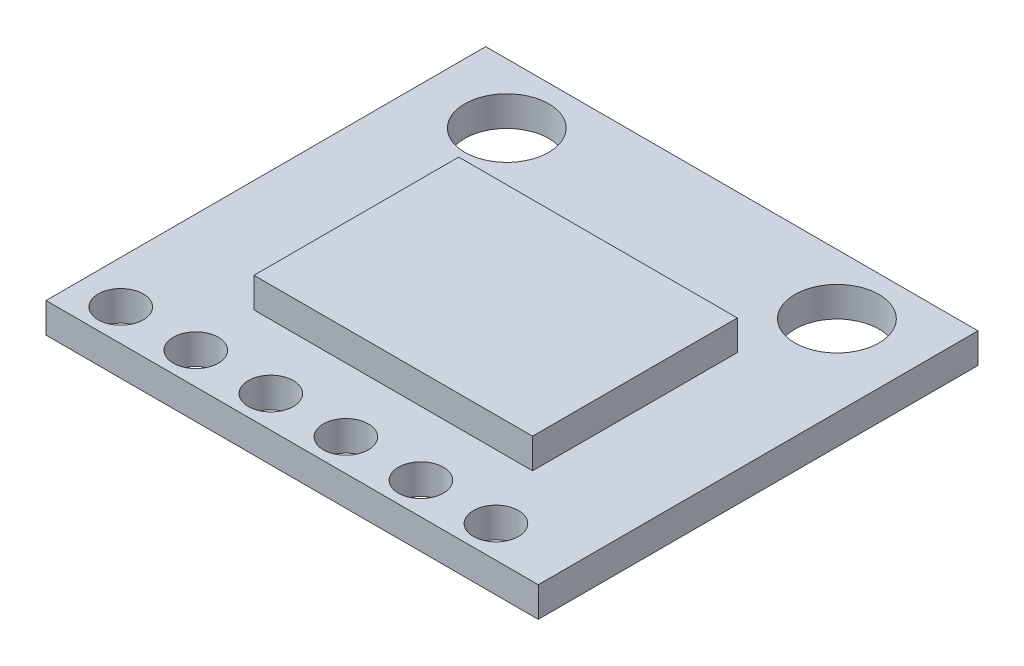
ISO-10303-21;
HEADER;
FILE_DESCRIPTION(('STEP AP214'),'2;1');
FILE_NAME('part.step','',(''),(''),'','','');
FILE_SCHEMA(('AUTOMOTIVE_DESIGN { 1 0 10303 214 1 1 1 1 }'));
ENDSEC;
DATA;
#1=APPLICATION_CONTEXT('core data for automotive mechanical design processes');
#2=APPLICATION_PROTOCOL_DEFINITION('international standard','automotive_design',2000,#1);
#3=PRODUCT_CONTEXT('',#1,'mechanical');
#4=PRODUCT('Part','Part','',(#3));
#5=PRODUCT_RELATED_PRODUCT_CATEGORY('part','',(#4));
#6=PRODUCT_DEFINITION_FORMATION('','',#4);
#7=PRODUCT_DEFINITION_CONTEXT('part definition',#1,'design');
#8=PRODUCT_DEFINITION('design','',#6,#7);
#9=PRODUCT_DEFINITION_SHAPE('','',#8);
#10=(LENGTH_UNIT() NAMED_UNIT(*) SI_UNIT(.MILLI.,.METRE.));
#11=(NAMED_UNIT(*) PLANE_ANGLE_UNIT() SI_UNIT($,.RADIAN.));
#12=(NAMED_UNIT(*) SI_UNIT($,.STERADIAN.) SOLID_ANGLE_UNIT());
#13=UNCERTAINTY_MEASURE_WITH_UNIT(LENGTH_MEASURE(1.E-05),#10,'distance_accuracy_value','');
#14=(GEOMETRIC_REPRESENTATION_CONTEXT(3) GLOBAL_UNCERTAINTY_ASSIGNED_CONTEXT((#13)) GLOBAL_UNIT_ASSIGNED_CONTEXT((#10,
#11,#12)) REPRESENTATION_CONTEXT('',''));
#15=CARTESIAN_POINT('',(0.,0.,0.));
#16=DIRECTION('',(0.,0.,1.));
#17=DIRECTION('',(1.,0.,0.));
#18=AXIS2_PLACEMENT_3D('',#15,#16,#17);
#19=CARTESIAN_POINT('',(0.,1.,0.));
#20=DIRECTION('',(0.,-1.,0.));
#21=DIRECTION('',(0.,0.,-1.));
#22=AXIS2_PLACEMENT_3D('',#19,#20,#21);
#23=PLANE('',#22);
#24=DIRECTION('',(0.,0.,1.));
#25=VECTOR('',#24,1.);
#26=CARTESIAN_POINT('',(0.,1.,0.));
#27=LINE('',#26,#25);
#28=CARTESIAN_POINT('',(0.,1.,-14.65));
#29=VERTEX_POINT('',#28);
#30=CARTESIAN_POINT('',(0.,1.,0.));
#31=VERTEX_POINT('',#30);
#32=EDGE_CURVE('E177',#29,#31,#27,.T.);
#33=ORIENTED_EDGE('',*,*,#32,.T.);
#34=DIRECTION('',(1.,0.,0.));
#35=VECTOR('',#34,1.);
#36=CARTESIAN_POINT('',(0.,1.,0.));
#37=LINE('',#36,#35);
#38=CARTESIAN_POINT('',(16.4,1.,0.));
#39=VERTEX_POINT('',#38);
#40=EDGE_CURVE('E180',#31,#39,#37,.T.);
#41=ORIENTED_EDGE('',*,*,#40,.T.);
#42=DIRECTION('',(0.,0.,-1.));
#43=VECTOR('',#42,1.);
#44=CARTESIAN_POINT('',(16.4,1.,0.));
#45=LINE('',#44,#43);
#46=CARTESIAN_POINT('',(16.4,1.,-14.65));
#47=VERTEX_POINT('',#46);
#48=EDGE_CURVE('E183',#39,#47,#45,.T.);
#49=ORIENTED_EDGE('',*,*,#48,.T.);
#50=DIRECTION('',(-1.,0.,0.));
#51=VECTOR('',#50,1.);
#52=CARTESIAN_POINT('',(0.,1.,-14.65));
#53=LINE('',#52,#51);
#54=EDGE_CURVE('E185',#47,#29,#53,.T.);
#55=ORIENTED_EDGE('',*,*,#54,.T.);
#56=EDGE_LOOP('',(#33,#41,#49,#55));
#57=FACE_BOUND('',#56,.T.);
#58=CARTESIAN_POINT('',(1.42900438295839,1.,-1.06119506588286));
#59=DIRECTION('',(0.,1.,0.));
#60=DIRECTION('',(0.,0.,1.));
#61=AXIS2_PLACEMENT_3D('',#58,#59,#60);
#62=CIRCLE('',#61,0.75);
#63=CARTESIAN_POINT('',(1.42900438295839,1.,-0.311195065882863));
#64=VERTEX_POINT('',#63);
#65=EDGE_CURVE('E150',#64,#64,#62,.T.);
#66=ORIENTED_EDGE('',*,*,#65,.F.);
#67=EDGE_LOOP('',(#66));
#68=FACE_BOUND('',#67,.T.);
#69=CARTESIAN_POINT('',(13.9290043829584,1.,-1.06119506588286));
#70=DIRECTION('',(0.,1.,0.));
#71=DIRECTION('',(0.,0.,1.));
#72=AXIS2_PLACEMENT_3D('',#69,#70,#71);
#73=CIRCLE('',#72,0.75);
#74=CARTESIAN_POINT('',(13.9290043829584,1.,-0.311195065882862));
#75=VERTEX_POINT('',#74);
#76=EDGE_CURVE('E135',#75,#75,#73,.T.);
#77=ORIENTED_EDGE('',*,*,#76,.F.);
#78=EDGE_LOOP('',(#77));
#79=FACE_BOUND('',#78,.T.);
#80=CARTESIAN_POINT('',(2.7,1.,-12.65));
#81=DIRECTION('',(0.,1.,0.));
#82=DIRECTION('',(0.,0.,1.));
#83=AXIS2_PLACEMENT_3D('',#80,#81,#82);
#84=CIRCLE('',#83,1.4);
#85=CARTESIAN_POINT('',(2.7,1.,-11.25));
#86=VERTEX_POINT('',#85);
#87=EDGE_CURVE('E142',#86,#86,#84,.T.);
#88=ORIENTED_EDGE('',*,*,#87,.F.);
#89=EDGE_LOOP('',(#88));
#90=FACE_BOUND('',#89,.T.);
#91=CARTESIAN_POINT('',(13.7,1.,-12.65));
#92=DIRECTION('',(0.,1.,0.));
#93=DIRECTION('',(0.,0.,1.));
#94=AXIS2_PLACEMENT_3D('',#91,#92,#93);
#95=CIRCLE('',#94,1.4);
#96=CARTESIAN_POINT('',(13.7,1.,-11.25));
#97=VERTEX_POINT('',#96);
#98=EDGE_CURVE('E126',#97,#97,#95,.T.);
#99=ORIENTED_EDGE('',*,*,#98,.F.);
#100=EDGE_LOOP('',(#99));
#101=FACE_BOUND('',#100,.T.);
#102=CARTESIAN_POINT('',(11.4290043829584,1.,-1.06119506588286));
#103=DIRECTION('',(0.,1.,0.));
#104=DIRECTION('',(0.,0.,1.));
#105=AXIS2_PLACEMENT_3D('',#102,#103,#104);
#106=CIRCLE('',#105,0.75);
#107=CARTESIAN_POINT('',(11.4290043829584,1.,-0.311195065882862));
#108=VERTEX_POINT('',#107);
#109=EDGE_CURVE('E166',#108,#108,#106,.T.);
#110=ORIENTED_EDGE('',*,*,#109,.F.);
#111=EDGE_LOOP('',(#110));
#112=FACE_BOUND('',#111,.T.);
#113=CARTESIAN_POINT('',(8.92900438295839,1.,-1.06119506588286));
#114=DIRECTION('',(0.,1.,0.));
#115=DIRECTION('',(0.,0.,1.));
#116=AXIS2_PLACEMENT_3D('',#113,#114,#115);
#117=CIRCLE('',#116,0.75);
#118=CARTESIAN_POINT('',(8.92900438295839,1.,-0.311195065882862));
#119=VERTEX_POINT('',#118);
#120=EDGE_CURVE('E160',#119,#119,#117,.T.);
#121=ORIENTED_EDGE('',*,*,#120,.F.);
#122=EDGE_LOOP('',(#121));
#123=FACE_BOUND('',#122,.T.);
#124=CARTESIAN_POINT('',(6.42900438295839,1.,-1.06119506588286));
#125=DIRECTION('',(0.,1.,0.));
#126=DIRECTION('',(0.,0.,1.));
#127=AXIS2_PLACEMENT_3D('',#124,#125,#126);
#128=CIRCLE('',#127,0.749999999999999);
#129=CARTESIAN_POINT('',(6.42900438295839,1.,-0.311195065882863));
#130=VERTEX_POINT('',#129);
#131=EDGE_CURVE('E154',#130,#130,#128,.T.);
#132=ORIENTED_EDGE('',*,*,#131,.F.);
#133=EDGE_LOOP('',(#132));
#134=FACE_BOUND('',#133,.T.);
#135=CARTESIAN_POINT('',(3.92900438295839,1.,-1.06119506588286));
#136=DIRECTION('',(0.,1.,0.));
#137=DIRECTION('',(0.,0.,1.));
#138=AXIS2_PLACEMENT_3D('',#135,#136,#137);
#139=CIRCLE('',#138,0.749999999999999);
#140=CARTESIAN_POINT('',(3.92900438295839,1.,-0.311195065882863));
#141=VERTEX_POINT('',#140);
#142=EDGE_CURVE('E147',#141,#141,#139,.T.);
#143=ORIENTED_EDGE('',*,*,#142,.F.);
#144=EDGE_LOOP('',(#143));
#145=FACE_BOUND('',#144,.T.);
#146=DIRECTION('',(0.,0.,1.));
#147=VECTOR('',#146,1.);
#148=CARTESIAN_POINT('',(3.7367219902647,1.,-10.0131106194997));
#149=LINE('',#148,#147);
#150=CARTESIAN_POINT('',(3.7367219902647,1.,-10.0131106194997));
#151=VERTEX_POINT('',#150);
#152=CARTESIAN_POINT('',(3.7367219902647,1.,-3.19139593416561));
#153=VERTEX_POINT('',#152);
#154=EDGE_CURVE('E122',#151,#153,#149,.T.);
#155=ORIENTED_EDGE('',*,*,#154,.F.);
#156=DIRECTION('',(-1.,0.,0.));
#157=VECTOR('',#156,1.);
#158=CARTESIAN_POINT('',(3.7367219902647,1.,-10.0131106194997));
#159=LINE('',#158,#157);
#160=CARTESIAN_POINT('',(13.0183114877824,1.,-10.0131106194997));
#161=VERTEX_POINT('',#160);
#162=EDGE_CURVE('E119',#161,#151,#159,.T.);
#163=ORIENTED_EDGE('',*,*,#162,.F.);
#164=DIRECTION('',(0.,0.,-1.));
#165=VECTOR('',#164,1.);
#166=CARTESIAN_POINT('',(13.0183114877824,1.,-10.0131106194997));
#167=LINE('',#166,#165);
#168=CARTESIAN_POINT('',(13.0183114877824,1.,-3.19139593416561));
#169=VERTEX_POINT('',#168);
#170=EDGE_CURVE('E57',#169,#161,#167,.T.);
#171=ORIENTED_EDGE('',*,*,#170,.F.);
#172=DIRECTION('',(1.,0.,0.));
#173=VECTOR('',#172,1.);
#174=CARTESIAN_POINT('',(3.7367219902647,1.,-3.19139593416561));
#175=LINE('',#174,#173);
#176=EDGE_CURVE('E52',#153,#169,#175,.T.);
#177=ORIENTED_EDGE('',*,*,#176,.F.);
#178=EDGE_LOOP('',(#155,#163,#171,#177));
#179=FACE_BOUND('',#178,.T.);
#180=ADVANCED_FACE('F37',(#57,#68,#79,#90,#101,#112,#123,#134,#145,#179),#23,.F.);
#181=CARTESIAN_POINT('',(0.,1.,0.));
#182=DIRECTION('',(1.,0.,0.));
#183=DIRECTION('',(0.,0.,-1.));
#184=AXIS2_PLACEMENT_3D('',#181,#182,#183);
#185=PLANE('',#184);
#186=DIRECTION('',(0.,0.,1.));
#187=VECTOR('',#186,1.);
#188=CARTESIAN_POINT('',(0.,0.,0.));
#189=LINE('',#188,#187);
#190=CARTESIAN_POINT('',(0.,0.,-14.65));
#191=VERTEX_POINT('',#190);
#192=CARTESIAN_POINT('',(0.,0.,0.));
#193=VERTEX_POINT('',#192);
#194=EDGE_CURVE('E174',#191,#193,#189,.T.);
#195=ORIENTED_EDGE('',*,*,#194,.T.);
#196=DIRECTION('',(0.,-1.,0.));
#197=VECTOR('',#196,1.);
#198=CARTESIAN_POINT('',(0.,1.,0.));
#199=LINE('',#198,#197);
#200=EDGE_CURVE('E11',#31,#193,#199,.T.);
#201=ORIENTED_EDGE('',*,*,#200,.F.);
#202=ORIENTED_EDGE('',*,*,#32,.F.);
#203=DIRECTION('',(0.,-1.,0.));
#204=VECTOR('',#203,1.);
#205=CARTESIAN_POINT('',(0.,1.,-14.65));
#206=LINE('',#205,#204);
#207=EDGE_CURVE('E187',#29,#191,#206,.T.);
#208=ORIENTED_EDGE('',*,*,#207,.T.);
#209=EDGE_LOOP('',(#195,#201,#202,#208));
#210=FACE_BOUND('',#209,.T.);
#211=ADVANCED_FACE('F39',(#210),#185,.F.);
#212=CARTESIAN_POINT('',(0.,1.,0.));
#213=DIRECTION('',(0.,0.,-1.));
#214=DIRECTION('',(-1.,0.,0.));
#215=AXIS2_PLACEMENT_3D('',#212,#213,#214);
#216=PLANE('',#215);
#217=DIRECTION('',(1.,0.,0.));
#218=VECTOR('',#217,1.);
#219=CARTESIAN_POINT('',(0.,0.,0.));
#220=LINE('',#219,#218);
#221=CARTESIAN_POINT('',(16.4,0.,0.));
#222=VERTEX_POINT('',#221);
#223=EDGE_CURVE('E190',#193,#222,#220,.T.);
#224=ORIENTED_EDGE('',*,*,#223,.T.);
#225=DIRECTION('',(0.,-1.,0.));
#226=VECTOR('',#225,1.);
#227=CARTESIAN_POINT('',(16.4,1.,0.));
#228=LINE('',#227,#226);
#229=EDGE_CURVE('E45',#39,#222,#228,.T.);
#230=ORIENTED_EDGE('',*,*,#229,.F.);
#231=ORIENTED_EDGE('',*,*,#40,.F.);
#232=ORIENTED_EDGE('',*,*,#200,.T.);
#233=EDGE_LOOP('',(#224,#230,#231,#232));
#234=FACE_BOUND('',#233,.T.);
#235=ADVANCED_FACE('F220',(#234),#216,.F.);
#236=CARTESIAN_POINT('',(16.4,1.,0.));
#237=DIRECTION('',(-1.,0.,0.));
#238=DIRECTION('',(0.,0.,1.));
#239=AXIS2_PLACEMENT_3D('',#236,#237,#238);
#240=PLANE('',#239);
#241=DIRECTION('',(0.,0.,-1.));
#242=VECTOR('',#241,1.);
#243=CARTESIAN_POINT('',(16.4,0.,0.));
#244=LINE('',#243,#242);
#245=CARTESIAN_POINT('',(16.4,0.,-14.65));
#246=VERTEX_POINT('',#245);
#247=EDGE_CURVE('E192',#222,#246,#244,.T.);
#248=ORIENTED_EDGE('',*,*,#247,.T.);
#249=DIRECTION('',(0.,-1.,0.));
#250=VECTOR('',#249,1.);
#251=CARTESIAN_POINT('',(16.4,1.,-14.65));
#252=LINE('',#251,#250);
#253=EDGE_CURVE('E197',#47,#246,#252,.T.);
#254=ORIENTED_EDGE('',*,*,#253,.F.);
#255=ORIENTED_EDGE('',*,*,#48,.F.);
#256=ORIENTED_EDGE('',*,*,#229,.T.);
#257=EDGE_LOOP('',(#248,#254,#255,#256));
#258=FACE_BOUND('',#257,.T.);
#259=ADVANCED_FACE('F204',(#258),#240,.F.);
#260=CARTESIAN_POINT('',(0.,1.,-14.65));
#261=DIRECTION('',(0.,0.,1.));
#262=DIRECTION('',(1.,0.,0.));
#263=AXIS2_PLACEMENT_3D('',#260,#261,#262);
#264=PLANE('',#263);
#265=DIRECTION('',(-1.,0.,0.));
#266=VECTOR('',#265,1.);
#267=CARTESIAN_POINT('',(0.,0.,-14.65));
#268=LINE('',#267,#266);
#269=EDGE_CURVE('E181',#246,#191,#268,.T.);
#270=ORIENTED_EDGE('',*,*,#269,.T.);
#271=ORIENTED_EDGE('',*,*,#207,.F.);
#272=ORIENTED_EDGE('',*,*,#54,.F.);
#273=ORIENTED_EDGE('',*,*,#253,.T.);
#274=EDGE_LOOP('',(#270,#271,#272,#273));
#275=FACE_BOUND('',#274,.T.);
#276=ADVANCED_FACE('F213',(#275),#264,.F.);
#277=CARTESIAN_POINT('',(0.,0.,0.));
#278=DIRECTION('',(0.,-1.,0.));
#279=DIRECTION('',(0.,0.,-1.));
#280=AXIS2_PLACEMENT_3D('',#277,#278,#279);
#281=PLANE('',#280);
#282=CARTESIAN_POINT('',(3.92900438295839,0.,-1.06119506588286));
#283=DIRECTION('',(0.,1.,0.));
#284=DIRECTION('',(0.,0.,1.));
#285=AXIS2_PLACEMENT_3D('',#282,#283,#284);
#286=CIRCLE('',#285,0.749999999999999);
#287=CARTESIAN_POINT('',(3.92900438295839,0.,-0.311195065882863));
#288=VERTEX_POINT('',#287);
#289=EDGE_CURVE('E151',#288,#288,#286,.T.);
#290=ORIENTED_EDGE('',*,*,#289,.T.);
#291=EDGE_LOOP('',(#290));
#292=FACE_BOUND('',#291,.T.);
#293=CARTESIAN_POINT('',(6.42900438295839,0.,-1.06119506588286));
#294=DIRECTION('',(0.,1.,0.));
#295=DIRECTION('',(0.,0.,1.));
#296=AXIS2_PLACEMENT_3D('',#293,#294,#295);
#297=CIRCLE('',#296,0.749999999999999);
#298=CARTESIAN_POINT('',(6.42900438295839,0.,-0.311195065882863));
#299=VERTEX_POINT('',#298);
#300=EDGE_CURVE('E157',#299,#299,#297,.T.);
#301=ORIENTED_EDGE('',*,*,#300,.T.);
#302=EDGE_LOOP('',(#301));
#303=FACE_BOUND('',#302,.T.);
#304=CARTESIAN_POINT('',(8.92900438295839,0.,-1.06119506588286));
#305=DIRECTION('',(0.,1.,0.));
#306=DIRECTION('',(0.,0.,1.));
#307=AXIS2_PLACEMENT_3D('',#304,#305,#306);
#308=CIRCLE('',#307,0.75);
#309=CARTESIAN_POINT('',(8.92900438295839,0.,-0.311195065882862));
#310=VERTEX_POINT('',#309);
#311=EDGE_CURVE('E163',#310,#310,#308,.T.);
#312=ORIENTED_EDGE('',*,*,#311,.T.);
#313=EDGE_LOOP('',(#312));
#314=FACE_BOUND('',#313,.T.);
#315=CARTESIAN_POINT('',(11.4290043829584,0.,-1.06119506588286));
#316=DIRECTION('',(0.,1.,0.));
#317=DIRECTION('',(0.,0.,1.));
#318=AXIS2_PLACEMENT_3D('',#315,#316,#317);
#319=CIRCLE('',#318,0.75);
#320=CARTESIAN_POINT('',(11.4290043829584,0.,-0.311195065882862));
#321=VERTEX_POINT('',#320);
#322=EDGE_CURVE('E138',#321,#321,#319,.T.);
#323=ORIENTED_EDGE('',*,*,#322,.T.);
#324=EDGE_LOOP('',(#323));
#325=FACE_BOUND('',#324,.T.);
#326=CARTESIAN_POINT('',(13.7,0.,-12.65));
#327=DIRECTION('',(0.,1.,0.));
#328=DIRECTION('',(0.,0.,1.));
#329=AXIS2_PLACEMENT_3D('',#326,#327,#328);
#330=CIRCLE('',#329,1.4);
#331=CARTESIAN_POINT('',(13.7,0.,-11.25));
#332=VERTEX_POINT('',#331);
#333=EDGE_CURVE('E123',#332,#332,#330,.T.);
#334=ORIENTED_EDGE('',*,*,#333,.T.);
#335=EDGE_LOOP('',(#334));
#336=FACE_BOUND('',#335,.T.);
#337=CARTESIAN_POINT('',(2.7,0.,-12.65));
#338=DIRECTION('',(0.,1.,0.));
#339=DIRECTION('',(0.,0.,1.));
#340=AXIS2_PLACEMENT_3D('',#337,#338,#339);
#341=CIRCLE('',#340,1.4);
#342=CARTESIAN_POINT('',(2.7,0.,-11.25));
#343=VERTEX_POINT('',#342);
#344=EDGE_CURVE('E133',#343,#343,#341,.T.);
#345=ORIENTED_EDGE('',*,*,#344,.T.);
#346=EDGE_LOOP('',(#345));
#347=FACE_BOUND('',#346,.T.);
#348=CARTESIAN_POINT('',(13.9290043829584,0.,-1.06119506588286));
#349=DIRECTION('',(0.,1.,0.));
#350=DIRECTION('',(0.,0.,1.));
#351=AXIS2_PLACEMENT_3D('',#348,#349,#350);
#352=CIRCLE('',#351,0.75);
#353=CARTESIAN_POINT('',(13.9290043829584,0.,-0.311195065882862));
#354=VERTEX_POINT('',#353);
#355=EDGE_CURVE('E139',#354,#354,#352,.T.);
#356=ORIENTED_EDGE('',*,*,#355,.T.);
#357=EDGE_LOOP('',(#356));
#358=FACE_BOUND('',#357,.T.);
#359=CARTESIAN_POINT('',(1.42900438295839,0.,-1.06119506588286));
#360=DIRECTION('',(0.,1.,0.));
#361=DIRECTION('',(0.,0.,1.));
#362=AXIS2_PLACEMENT_3D('',#359,#360,#361);
#363=CIRCLE('',#362,0.75);
#364=CARTESIAN_POINT('',(1.42900438295839,0.,-0.311195065882863));
#365=VERTEX_POINT('',#364);
#366=EDGE_CURVE('E171',#365,#365,#363,.T.);
#367=ORIENTED_EDGE('',*,*,#366,.T.);
#368=EDGE_LOOP('',(#367));
#369=FACE_BOUND('',#368,.T.);
#370=ORIENTED_EDGE('',*,*,#194,.F.);
#371=ORIENTED_EDGE('',*,*,#269,.F.);
#372=ORIENTED_EDGE('',*,*,#247,.F.);
#373=ORIENTED_EDGE('',*,*,#223,.F.);
#374=EDGE_LOOP('',(#370,#371,#372,#373));
#375=FACE_BOUND('',#374,.T.);
#376=ADVANCED_FACE('F210',(#292,#303,#314,#325,#336,#347,#358,#369,#375),#281,.T.);
#377=CARTESIAN_POINT('',(1.42900438295839,0.,-1.06119506588286));
#378=DIRECTION('',(0.,1.,0.));
#379=DIRECTION('',(0.,0.,1.));
#380=AXIS2_PLACEMENT_3D('',#377,#378,#379);
#381=CYLINDRICAL_SURFACE('',#380,0.75);
#382=ORIENTED_EDGE('',*,*,#366,.F.);
#383=EDGE_LOOP('',(#382));
#384=FACE_BOUND('',#383,.T.);
#385=ORIENTED_EDGE('',*,*,#65,.T.);
#386=EDGE_LOOP('',(#385));
#387=FACE_BOUND('',#386,.T.);
#388=ADVANCED_FACE('F233',(#384,#387),#381,.F.);
#389=CARTESIAN_POINT('',(13.9290043829584,0.,-1.06119506588286));
#390=DIRECTION('',(0.,1.,0.));
#391=DIRECTION('',(0.,0.,1.));
#392=AXIS2_PLACEMENT_3D('',#389,#390,#391);
#393=CYLINDRICAL_SURFACE('',#392,0.75);
#394=ORIENTED_EDGE('',*,*,#355,.F.);
#395=EDGE_LOOP('',(#394));
#396=FACE_BOUND('',#395,.T.);
#397=ORIENTED_EDGE('',*,*,#76,.T.);
#398=EDGE_LOOP('',(#397));
#399=FACE_BOUND('',#398,.T.);
#400=ADVANCED_FACE('F253',(#396,#399),#393,.F.);
#401=CARTESIAN_POINT('',(2.7,0.,-12.65));
#402=DIRECTION('',(0.,1.,0.));
#403=DIRECTION('',(0.,0.,1.));
#404=AXIS2_PLACEMENT_3D('',#401,#402,#403);
#405=CYLINDRICAL_SURFACE('',#404,1.4);
#406=ORIENTED_EDGE('',*,*,#344,.F.);
#407=EDGE_LOOP('',(#406));
#408=FACE_BOUND('',#407,.T.);
#409=ORIENTED_EDGE('',*,*,#87,.T.);
#410=EDGE_LOOP('',(#409));
#411=FACE_BOUND('',#410,.T.);
#412=ADVANCED_FACE('F260',(#408,#411),#405,.F.);
#413=CARTESIAN_POINT('',(13.7,0.,-12.65));
#414=DIRECTION('',(0.,1.,0.));
#415=DIRECTION('',(0.,0.,1.));
#416=AXIS2_PLACEMENT_3D('',#413,#414,#415);
#417=CYLINDRICAL_SURFACE('',#416,1.4);
#418=ORIENTED_EDGE('',*,*,#333,.F.);
#419=EDGE_LOOP('',(#418));
#420=FACE_BOUND('',#419,.T.);
#421=ORIENTED_EDGE('',*,*,#98,.T.);
#422=EDGE_LOOP('',(#421));
#423=FACE_BOUND('',#422,.T.);
#424=ADVANCED_FACE('F268',(#420,#423),#417,.F.);
#425=CARTESIAN_POINT('',(11.4290043829584,0.,-1.06119506588286));
#426=DIRECTION('',(0.,1.,0.));
#427=DIRECTION('',(0.,0.,1.));
#428=AXIS2_PLACEMENT_3D('',#425,#426,#427);
#429=CYLINDRICAL_SURFACE('',#428,0.75);
#430=ORIENTED_EDGE('',*,*,#322,.F.);
#431=EDGE_LOOP('',(#430));
#432=FACE_BOUND('',#431,.T.);
#433=ORIENTED_EDGE('',*,*,#109,.T.);
#434=EDGE_LOOP('',(#433));
#435=FACE_BOUND('',#434,.T.);
#436=ADVANCED_FACE('F276',(#432,#435),#429,.F.);
#437=CARTESIAN_POINT('',(8.92900438295839,0.,-1.06119506588286));
#438=DIRECTION('',(0.,1.,0.));
#439=DIRECTION('',(0.,0.,1.));
#440=AXIS2_PLACEMENT_3D('',#437,#438,#439);
#441=CYLINDRICAL_SURFACE('',#440,0.75);
#442=ORIENTED_EDGE('',*,*,#311,.F.);
#443=EDGE_LOOP('',(#442));
#444=FACE_BOUND('',#443,.T.);
#445=ORIENTED_EDGE('',*,*,#120,.T.);
#446=EDGE_LOOP('',(#445));
#447=FACE_BOUND('',#446,.T.);
#448=ADVANCED_FACE('F284',(#444,#447),#441,.F.);
#449=CARTESIAN_POINT('',(6.42900438295839,0.,-1.06119506588286));
#450=DIRECTION('',(0.,1.,0.));
#451=DIRECTION('',(0.,0.,1.));
#452=AXIS2_PLACEMENT_3D('',#449,#450,#451);
#453=CYLINDRICAL_SURFACE('',#452,0.749999999999999);
#454=ORIENTED_EDGE('',*,*,#300,.F.);
#455=EDGE_LOOP('',(#454));
#456=FACE_BOUND('',#455,.T.);
#457=ORIENTED_EDGE('',*,*,#131,.T.);
#458=EDGE_LOOP('',(#457));
#459=FACE_BOUND('',#458,.T.);
#460=ADVANCED_FACE('F291',(#456,#459),#453,.F.);
#461=CARTESIAN_POINT('',(3.92900438295839,0.,-1.06119506588286));
#462=DIRECTION('',(0.,1.,0.));
#463=DIRECTION('',(0.,0.,1.));
#464=AXIS2_PLACEMENT_3D('',#461,#462,#463);
#465=CYLINDRICAL_SURFACE('',#464,0.749999999999999);
#466=ORIENTED_EDGE('',*,*,#289,.F.);
#467=EDGE_LOOP('',(#466));
#468=FACE_BOUND('',#467,.T.);
#469=ORIENTED_EDGE('',*,*,#142,.T.);
#470=EDGE_LOOP('',(#469));
#471=FACE_BOUND('',#470,.T.);
#472=ADVANCED_FACE('F299',(#468,#471),#465,.F.);
#473=CARTESIAN_POINT('',(3.7367219902647,2.,-10.0131106194997));
#474=DIRECTION('',(1.,0.,0.));
#475=DIRECTION('',(0.,0.,-1.));
#476=AXIS2_PLACEMENT_3D('',#473,#474,#475);
#477=PLANE('',#476);
#478=ORIENTED_EDGE('',*,*,#154,.T.);
#479=DIRECTION('',(0.,-1.,0.));
#480=VECTOR('',#479,1.);
#481=CARTESIAN_POINT('',(3.7367219902647,2.,-3.19139593416561));
#482=LINE('',#481,#480);
#483=CARTESIAN_POINT('',(3.7367219902647,2.,-3.19139593416561));
#484=VERTEX_POINT('',#483);
#485=EDGE_CURVE('E103',#484,#153,#482,.T.);
#486=ORIENTED_EDGE('',*,*,#485,.F.);
#487=DIRECTION('',(0.,0.,1.));
#488=VECTOR('',#487,1.);
#489=CARTESIAN_POINT('',(3.7367219902647,2.,-10.0131106194997));
#490=LINE('',#489,#488);
#491=CARTESIAN_POINT('',(3.7367219902647,2.,-10.0131106194997));
#492=VERTEX_POINT('',#491);
#493=EDGE_CURVE('E110',#492,#484,#490,.T.);
#494=ORIENTED_EDGE('',*,*,#493,.F.);
#495=DIRECTION('',(0.,-1.,0.));
#496=VECTOR('',#495,1.);
#497=CARTESIAN_POINT('',(3.7367219902647,2.,-10.0131106194997));
#498=LINE('',#497,#496);
#499=EDGE_CURVE('E432',#492,#151,#498,.T.);
#500=ORIENTED_EDGE('',*,*,#499,.T.);
#501=EDGE_LOOP('',(#478,#486,#494,#500));
#502=FACE_BOUND('',#501,.T.);
#503=ADVANCED_FACE('F121',(#502),#477,.F.);
#504=CARTESIAN_POINT('',(3.7367219902647,2.,-3.19139593416561));
#505=DIRECTION('',(0.,0.,-1.));
#506=DIRECTION('',(-1.,0.,0.));
#507=AXIS2_PLACEMENT_3D('',#504,#505,#506);
#508=PLANE('',#507);
#509=ORIENTED_EDGE('',*,*,#176,.T.);
#510=DIRECTION('',(0.,-1.,0.));
#511=VECTOR('',#510,1.);
#512=CARTESIAN_POINT('',(13.0183114877824,2.,-3.19139593416561));
#513=LINE('',#512,#511);
#514=CARTESIAN_POINT('',(13.0183114877824,2.,-3.19139593416561));
#515=VERTEX_POINT('',#514);
#516=EDGE_CURVE('E106',#515,#169,#513,.T.);
#517=ORIENTED_EDGE('',*,*,#516,.F.);
#518=DIRECTION('',(1.,0.,0.));
#519=VECTOR('',#518,1.);
#520=CARTESIAN_POINT('',(3.7367219902647,2.,-3.19139593416561));
#521=LINE('',#520,#519);
#522=EDGE_CURVE('E99',#484,#515,#521,.T.);
#523=ORIENTED_EDGE('',*,*,#522,.F.);
#524=ORIENTED_EDGE('',*,*,#485,.T.);
#525=EDGE_LOOP('',(#509,#517,#523,#524));
#526=FACE_BOUND('',#525,.T.);
#527=ADVANCED_FACE('F101',(#526),#508,.F.);
#528=CARTESIAN_POINT('',(13.0183114877824,2.,-10.0131106194997));
#529=DIRECTION('',(-1.,0.,0.));
#530=DIRECTION('',(0.,0.,1.));
#531=AXIS2_PLACEMENT_3D('',#528,#529,#530);
#532=PLANE('',#531);
#533=ORIENTED_EDGE('',*,*,#170,.T.);
#534=DIRECTION('',(0.,-1.,0.));
#535=VECTOR('',#534,1.);
#536=CARTESIAN_POINT('',(13.0183114877824,2.,-10.0131106194997));
#537=LINE('',#536,#535);
#538=CARTESIAN_POINT('',(13.0183114877824,2.,-10.0131106194997));
#539=VERTEX_POINT('',#538);
#540=EDGE_CURVE('E128',#539,#161,#537,.T.);
#541=ORIENTED_EDGE('',*,*,#540,.F.);
#542=DIRECTION('',(0.,0.,-1.));
#543=VECTOR('',#542,1.);
#544=CARTESIAN_POINT('',(13.0183114877824,2.,-10.0131106194997));
#545=LINE('',#544,#543);
#546=EDGE_CURVE('E109',#515,#539,#545,.T.);
#547=ORIENTED_EDGE('',*,*,#546,.F.);
#548=ORIENTED_EDGE('',*,*,#516,.T.);
#549=EDGE_LOOP('',(#533,#541,#547,#548));
#550=FACE_BOUND('',#549,.T.);
#551=ADVANCED_FACE('F320',(#550),#532,.F.);
#552=CARTESIAN_POINT('',(3.7367219902647,2.,-10.0131106194997));
#553=DIRECTION('',(0.,0.,1.));
#554=DIRECTION('',(1.,0.,0.));
#555=AXIS2_PLACEMENT_3D('',#552,#553,#554);
#556=PLANE('',#555);
#557=ORIENTED_EDGE('',*,*,#162,.T.);
#558=ORIENTED_EDGE('',*,*,#499,.F.);
#559=DIRECTION('',(-1.,0.,0.));
#560=VECTOR('',#559,1.);
#561=CARTESIAN_POINT('',(3.7367219902647,2.,-10.0131106194997));
#562=LINE('',#561,#560);
#563=EDGE_CURVE('E115',#539,#492,#562,.T.);
#564=ORIENTED_EDGE('',*,*,#563,.F.);
#565=ORIENTED_EDGE('',*,*,#540,.T.);
#566=EDGE_LOOP('',(#557,#558,#564,#565));
#567=FACE_BOUND('',#566,.T.);
#568=ADVANCED_FACE('F327',(#567),#556,.F.);
#569=CARTESIAN_POINT('',(0.,2.,0.));
#570=DIRECTION('',(0.,1.,0.));
#571=DIRECTION('',(0.,0.,1.));
#572=AXIS2_PLACEMENT_3D('',#569,#570,#571);
#573=PLANE('',#572);
#574=ORIENTED_EDGE('',*,*,#493,.T.);
#575=ORIENTED_EDGE('',*,*,#522,.T.);
#576=ORIENTED_EDGE('',*,*,#546,.T.);
#577=ORIENTED_EDGE('',*,*,#563,.T.);
#578=EDGE_LOOP('',(#574,#575,#576,#577));
#579=FACE_BOUND('',#578,.T.);
#580=ADVANCED_FACE('F113',(#579),#573,.T.);
#581=CLOSED_SHELL('',(#180,#211,#235,#259,#276,#376,#388,#400,#412,#424,#436,#448,#460,#472,
#503,#527,#551,#568,#580));
#582=MANIFOLD_SOLID_BREP('B2',#581);
#583=ADVANCED_BREP_SHAPE_REPRESENTATION('',(#18,#582),#14);
#584=SHAPE_DEFINITION_REPRESENTATION(#9,#583);
ENDSEC;
END-ISO-10303-21;
